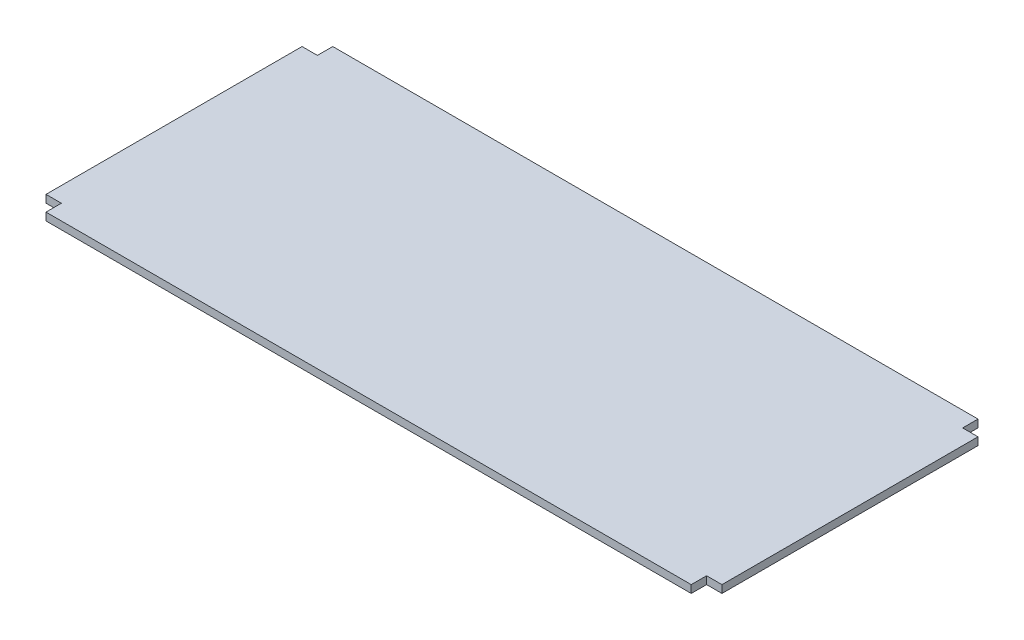
ISO-10303-21;
HEADER;
FILE_DESCRIPTION(('STEP AP214'),'2;1');
FILE_NAME('part.step','',(''),(''),'','','');
FILE_SCHEMA(('AUTOMOTIVE_DESIGN { 1 0 10303 214 1 1 1 1 }'));
ENDSEC;
DATA;
#1=APPLICATION_CONTEXT('core data for automotive mechanical design processes');
#2=APPLICATION_PROTOCOL_DEFINITION('international standard','automotive_design',2000,#1);
#3=PRODUCT_CONTEXT('',#1,'mechanical');
#4=PRODUCT('Part','Part','',(#3));
#5=PRODUCT_RELATED_PRODUCT_CATEGORY('part','',(#4));
#6=PRODUCT_DEFINITION_FORMATION('','',#4);
#7=PRODUCT_DEFINITION_CONTEXT('part definition',#1,'design');
#8=PRODUCT_DEFINITION('design','',#6,#7);
#9=PRODUCT_DEFINITION_SHAPE('','',#8);
#10=(LENGTH_UNIT() NAMED_UNIT(*) SI_UNIT(.MILLI.,.METRE.));
#11=(NAMED_UNIT(*) PLANE_ANGLE_UNIT() SI_UNIT($,.RADIAN.));
#12=(NAMED_UNIT(*) SI_UNIT($,.STERADIAN.) SOLID_ANGLE_UNIT());
#13=UNCERTAINTY_MEASURE_WITH_UNIT(LENGTH_MEASURE(1.E-05),#10,'distance_accuracy_value','');
#14=(GEOMETRIC_REPRESENTATION_CONTEXT(3) GLOBAL_UNCERTAINTY_ASSIGNED_CONTEXT((#13)) GLOBAL_UNIT_ASSIGNED_CONTEXT((#10,
#11,#12)) REPRESENTATION_CONTEXT('',''));
#15=CARTESIAN_POINT('',(0.,0.,0.));
#16=DIRECTION('',(0.,0.,1.));
#17=DIRECTION('',(1.,0.,0.));
#18=AXIS2_PLACEMENT_3D('',#15,#16,#17);
#19=CARTESIAN_POINT('',(-800.1,19.05,355.6));
#20=DIRECTION('',(1.,0.,0.));
#21=DIRECTION('',(0.,0.,-1.));
#22=AXIS2_PLACEMENT_3D('',#19,#20,#21);
#23=PLANE('',#22);
#24=DIRECTION('',(0.,0.,1.));
#25=VECTOR('',#24,1.);
#26=CARTESIAN_POINT('',(-800.1,0.,355.6));
#27=LINE('',#26,#25);
#28=CARTESIAN_POINT('',(-800.1,0.,317.5));
#29=VERTEX_POINT('',#28);
#30=CARTESIAN_POINT('',(-800.1,0.,355.6));
#31=VERTEX_POINT('',#30);
#32=EDGE_CURVE('E152',#29,#31,#27,.T.);
#33=ORIENTED_EDGE('',*,*,#32,.T.);
#34=DIRECTION('',(0.,-1.,0.));
#35=VECTOR('',#34,1.);
#36=CARTESIAN_POINT('',(-800.1,19.05,355.6));
#37=LINE('',#36,#35);
#38=CARTESIAN_POINT('',(-800.1,19.05,355.6));
#39=VERTEX_POINT('',#38);
#40=EDGE_CURVE('E11',#39,#31,#37,.T.);
#41=ORIENTED_EDGE('',*,*,#40,.F.);
#42=DIRECTION('',(0.,0.,1.));
#43=VECTOR('',#42,1.);
#44=CARTESIAN_POINT('',(-800.1,19.05,355.6));
#45=LINE('',#44,#43);
#46=CARTESIAN_POINT('',(-800.1,19.05,317.5));
#47=VERTEX_POINT('',#46);
#48=EDGE_CURVE('E174',#47,#39,#45,.T.);
#49=ORIENTED_EDGE('',*,*,#48,.F.);
#50=DIRECTION('',(0.,-1.,0.));
#51=VECTOR('',#50,1.);
#52=CARTESIAN_POINT('',(-800.1,19.05,317.5));
#53=LINE('',#52,#51);
#54=EDGE_CURVE('E148',#47,#29,#53,.T.);
#55=ORIENTED_EDGE('',*,*,#54,.T.);
#56=EDGE_LOOP('',(#33,#41,#49,#55));
#57=FACE_BOUND('',#56,.T.);
#58=ADVANCED_FACE('F32',(#57),#23,.F.);
#59=CARTESIAN_POINT('',(800.1,19.05,355.6));
#60=DIRECTION('',(0.,0.,-1.));
#61=DIRECTION('',(-1.,0.,0.));
#62=AXIS2_PLACEMENT_3D('',#59,#60,#61);
#63=PLANE('',#62);
#64=DIRECTION('',(1.,0.,0.));
#65=VECTOR('',#64,1.);
#66=CARTESIAN_POINT('',(800.1,0.,355.6));
#67=LINE('',#66,#65);
#68=CARTESIAN_POINT('',(800.1,0.,355.6));
#69=VERTEX_POINT('',#68);
#70=EDGE_CURVE('E155',#31,#69,#67,.T.);
#71=ORIENTED_EDGE('',*,*,#70,.T.);
#72=DIRECTION('',(0.,-1.,0.));
#73=VECTOR('',#72,1.);
#74=CARTESIAN_POINT('',(800.1,19.05,355.6));
#75=LINE('',#74,#73);
#76=CARTESIAN_POINT('',(800.1,19.05,355.6));
#77=VERTEX_POINT('',#76);
#78=EDGE_CURVE('E40',#77,#69,#75,.T.);
#79=ORIENTED_EDGE('',*,*,#78,.F.);
#80=DIRECTION('',(1.,0.,0.));
#81=VECTOR('',#80,1.);
#82=CARTESIAN_POINT('',(800.1,19.05,355.6));
#83=LINE('',#82,#81);
#84=EDGE_CURVE('E103',#39,#77,#83,.T.);
#85=ORIENTED_EDGE('',*,*,#84,.F.);
#86=ORIENTED_EDGE('',*,*,#40,.T.);
#87=EDGE_LOOP('',(#71,#79,#85,#86));
#88=FACE_BOUND('',#87,.T.);
#89=ADVANCED_FACE('F252',(#88),#63,.F.);
#90=CARTESIAN_POINT('',(800.1,19.05,355.6));
#91=DIRECTION('',(-1.,0.,0.));
#92=DIRECTION('',(0.,0.,1.));
#93=AXIS2_PLACEMENT_3D('',#90,#91,#92);
#94=PLANE('',#93);
#95=DIRECTION('',(0.,0.,-1.));
#96=VECTOR('',#95,1.);
#97=CARTESIAN_POINT('',(800.1,0.,355.6));
#98=LINE('',#97,#96);
#99=CARTESIAN_POINT('',(800.1,0.,317.5));
#100=VERTEX_POINT('',#99);
#101=EDGE_CURVE('E157',#69,#100,#98,.T.);
#102=ORIENTED_EDGE('',*,*,#101,.T.);
#103=DIRECTION('',(0.,-1.,0.));
#104=VECTOR('',#103,1.);
#105=CARTESIAN_POINT('',(800.1,19.05,317.5));
#106=LINE('',#105,#104);
#107=CARTESIAN_POINT('',(800.1,19.05,317.5));
#108=VERTEX_POINT('',#107);
#109=EDGE_CURVE('E193',#108,#100,#106,.T.);
#110=ORIENTED_EDGE('',*,*,#109,.F.);
#111=DIRECTION('',(0.,0.,-1.));
#112=VECTOR('',#111,1.);
#113=CARTESIAN_POINT('',(800.1,19.05,355.6));
#114=LINE('',#113,#112);
#115=EDGE_CURVE('E201',#77,#108,#114,.T.);
#116=ORIENTED_EDGE('',*,*,#115,.F.);
#117=ORIENTED_EDGE('',*,*,#78,.T.);
#118=EDGE_LOOP('',(#102,#110,#116,#117));
#119=FACE_BOUND('',#118,.T.);
#120=ADVANCED_FACE('F199',(#119),#94,.F.);
#121=CARTESIAN_POINT('',(838.2,19.05,317.5));
#122=DIRECTION('',(0.,0.,-1.));
#123=DIRECTION('',(-1.,0.,0.));
#124=AXIS2_PLACEMENT_3D('',#121,#122,#123);
#125=PLANE('',#124);
#126=DIRECTION('',(1.,0.,0.));
#127=VECTOR('',#126,1.);
#128=CARTESIAN_POINT('',(838.2,0.,317.5));
#129=LINE('',#128,#127);
#130=CARTESIAN_POINT('',(838.2,0.,317.5));
#131=VERTEX_POINT('',#130);
#132=EDGE_CURVE('E159',#100,#131,#129,.T.);
#133=ORIENTED_EDGE('',*,*,#132,.T.);
#134=DIRECTION('',(0.,-1.,0.));
#135=VECTOR('',#134,1.);
#136=CARTESIAN_POINT('',(838.2,19.05,317.5));
#137=LINE('',#136,#135);
#138=CARTESIAN_POINT('',(838.2,19.05,317.5));
#139=VERTEX_POINT('',#138);
#140=EDGE_CURVE('E190',#139,#131,#137,.T.);
#141=ORIENTED_EDGE('',*,*,#140,.F.);
#142=DIRECTION('',(1.,0.,0.));
#143=VECTOR('',#142,1.);
#144=CARTESIAN_POINT('',(838.2,19.05,317.5));
#145=LINE('',#144,#143);
#146=EDGE_CURVE('E219',#108,#139,#145,.T.);
#147=ORIENTED_EDGE('',*,*,#146,.F.);
#148=ORIENTED_EDGE('',*,*,#109,.T.);
#149=EDGE_LOOP('',(#133,#141,#147,#148));
#150=FACE_BOUND('',#149,.T.);
#151=ADVANCED_FACE('F210',(#150),#125,.F.);
#152=CARTESIAN_POINT('',(838.2,19.05,317.5));
#153=DIRECTION('',(-1.,0.,0.));
#154=DIRECTION('',(0.,0.,1.));
#155=AXIS2_PLACEMENT_3D('',#152,#153,#154);
#156=PLANE('',#155);
#157=DIRECTION('',(0.,0.,-1.));
#158=VECTOR('',#157,1.);
#159=CARTESIAN_POINT('',(838.2,0.,317.5));
#160=LINE('',#159,#158);
#161=CARTESIAN_POINT('',(838.2,0.,-317.5));
#162=VERTEX_POINT('',#161);
#163=EDGE_CURVE('E161',#131,#162,#160,.T.);
#164=ORIENTED_EDGE('',*,*,#163,.T.);
#165=DIRECTION('',(0.,-1.,0.));
#166=VECTOR('',#165,1.);
#167=CARTESIAN_POINT('',(838.2,19.05,-317.5));
#168=LINE('',#167,#166);
#169=CARTESIAN_POINT('',(838.2,19.05,-317.5));
#170=VERTEX_POINT('',#169);
#171=EDGE_CURVE('E187',#170,#162,#168,.T.);
#172=ORIENTED_EDGE('',*,*,#171,.F.);
#173=DIRECTION('',(0.,0.,-1.));
#174=VECTOR('',#173,1.);
#175=CARTESIAN_POINT('',(838.2,19.05,317.5));
#176=LINE('',#175,#174);
#177=EDGE_CURVE('E216',#139,#170,#176,.T.);
#178=ORIENTED_EDGE('',*,*,#177,.F.);
#179=ORIENTED_EDGE('',*,*,#140,.T.);
#180=EDGE_LOOP('',(#164,#172,#178,#179));
#181=FACE_BOUND('',#180,.T.);
#182=ADVANCED_FACE('F214',(#181),#156,.F.);
#183=CARTESIAN_POINT('',(838.2,19.05,-317.5));
#184=DIRECTION('',(0.,0.,1.));
#185=DIRECTION('',(1.,0.,0.));
#186=AXIS2_PLACEMENT_3D('',#183,#184,#185);
#187=PLANE('',#186);
#188=DIRECTION('',(-1.,0.,0.));
#189=VECTOR('',#188,1.);
#190=CARTESIAN_POINT('',(838.2,0.,-317.5));
#191=LINE('',#190,#189);
#192=CARTESIAN_POINT('',(800.1,0.,-317.5));
#193=VERTEX_POINT('',#192);
#194=EDGE_CURVE('E163',#162,#193,#191,.T.);
#195=ORIENTED_EDGE('',*,*,#194,.T.);
#196=DIRECTION('',(0.,-1.,0.));
#197=VECTOR('',#196,1.);
#198=CARTESIAN_POINT('',(800.1,19.05,-317.5));
#199=LINE('',#198,#197);
#200=CARTESIAN_POINT('',(800.1,19.05,-317.5));
#201=VERTEX_POINT('',#200);
#202=EDGE_CURVE('E184',#201,#193,#199,.T.);
#203=ORIENTED_EDGE('',*,*,#202,.F.);
#204=DIRECTION('',(-1.,0.,0.));
#205=VECTOR('',#204,1.);
#206=CARTESIAN_POINT('',(838.2,19.05,-317.5));
#207=LINE('',#206,#205);
#208=EDGE_CURVE('E218',#170,#201,#207,.T.);
#209=ORIENTED_EDGE('',*,*,#208,.F.);
#210=ORIENTED_EDGE('',*,*,#171,.T.);
#211=EDGE_LOOP('',(#195,#203,#209,#210));
#212=FACE_BOUND('',#211,.T.);
#213=ADVANCED_FACE('F265',(#212),#187,.F.);
#214=CARTESIAN_POINT('',(800.1,19.05,-355.6));
#215=DIRECTION('',(-1.,0.,0.));
#216=DIRECTION('',(0.,0.,1.));
#217=AXIS2_PLACEMENT_3D('',#214,#215,#216);
#218=PLANE('',#217);
#219=DIRECTION('',(0.,0.,-1.));
#220=VECTOR('',#219,1.);
#221=CARTESIAN_POINT('',(800.1,0.,-355.6));
#222=LINE('',#221,#220);
#223=CARTESIAN_POINT('',(800.1,0.,-355.6));
#224=VERTEX_POINT('',#223);
#225=EDGE_CURVE('E165',#193,#224,#222,.T.);
#226=ORIENTED_EDGE('',*,*,#225,.T.);
#227=DIRECTION('',(0.,-1.,0.));
#228=VECTOR('',#227,1.);
#229=CARTESIAN_POINT('',(800.1,19.05,-355.6));
#230=LINE('',#229,#228);
#231=CARTESIAN_POINT('',(800.1,19.05,-355.6));
#232=VERTEX_POINT('',#231);
#233=EDGE_CURVE('E181',#232,#224,#230,.T.);
#234=ORIENTED_EDGE('',*,*,#233,.F.);
#235=DIRECTION('',(0.,0.,-1.));
#236=VECTOR('',#235,1.);
#237=CARTESIAN_POINT('',(800.1,19.05,-355.6));
#238=LINE('',#237,#236);
#239=EDGE_CURVE('E221',#201,#232,#238,.T.);
#240=ORIENTED_EDGE('',*,*,#239,.F.);
#241=ORIENTED_EDGE('',*,*,#202,.T.);
#242=EDGE_LOOP('',(#226,#234,#240,#241));
#243=FACE_BOUND('',#242,.T.);
#244=ADVANCED_FACE('F268',(#243),#218,.F.);
#245=CARTESIAN_POINT('',(800.1,19.05,-355.6));
#246=DIRECTION('',(0.,0.,1.));
#247=DIRECTION('',(1.,0.,0.));
#248=AXIS2_PLACEMENT_3D('',#245,#246,#247);
#249=PLANE('',#248);
#250=DIRECTION('',(-1.,0.,0.));
#251=VECTOR('',#250,1.);
#252=CARTESIAN_POINT('',(800.1,0.,-355.6));
#253=LINE('',#252,#251);
#254=CARTESIAN_POINT('',(-800.1,0.,-355.6));
#255=VERTEX_POINT('',#254);
#256=EDGE_CURVE('E167',#224,#255,#253,.T.);
#257=ORIENTED_EDGE('',*,*,#256,.T.);
#258=DIRECTION('',(0.,-1.,0.));
#259=VECTOR('',#258,1.);
#260=CARTESIAN_POINT('',(-800.1,19.05,-355.6));
#261=LINE('',#260,#259);
#262=CARTESIAN_POINT('',(-800.1,19.05,-355.6));
#263=VERTEX_POINT('',#262);
#264=EDGE_CURVE('E178',#263,#255,#261,.T.);
#265=ORIENTED_EDGE('',*,*,#264,.F.);
#266=DIRECTION('',(-1.,0.,0.));
#267=VECTOR('',#266,1.);
#268=CARTESIAN_POINT('',(800.1,19.05,-355.6));
#269=LINE('',#268,#267);
#270=EDGE_CURVE('E227',#232,#263,#269,.T.);
#271=ORIENTED_EDGE('',*,*,#270,.F.);
#272=ORIENTED_EDGE('',*,*,#233,.T.);
#273=EDGE_LOOP('',(#257,#265,#271,#272));
#274=FACE_BOUND('',#273,.T.);
#275=ADVANCED_FACE('F233',(#274),#249,.F.);
#276=CARTESIAN_POINT('',(-800.1,19.05,-355.6));
#277=DIRECTION('',(1.,0.,0.));
#278=DIRECTION('',(0.,0.,-1.));
#279=AXIS2_PLACEMENT_3D('',#276,#277,#278);
#280=PLANE('',#279);
#281=DIRECTION('',(0.,0.,1.));
#282=VECTOR('',#281,1.);
#283=CARTESIAN_POINT('',(-800.1,0.,-355.6));
#284=LINE('',#283,#282);
#285=CARTESIAN_POINT('',(-800.1,0.,-317.5));
#286=VERTEX_POINT('',#285);
#287=EDGE_CURVE('E169',#255,#286,#284,.T.);
#288=ORIENTED_EDGE('',*,*,#287,.T.);
#289=DIRECTION('',(0.,-1.,0.));
#290=VECTOR('',#289,1.);
#291=CARTESIAN_POINT('',(-800.1,19.05,-317.5));
#292=LINE('',#291,#290);
#293=CARTESIAN_POINT('',(-800.1,19.05,-317.5));
#294=VERTEX_POINT('',#293);
#295=EDGE_CURVE('E143',#294,#286,#292,.T.);
#296=ORIENTED_EDGE('',*,*,#295,.F.);
#297=DIRECTION('',(0.,0.,1.));
#298=VECTOR('',#297,1.);
#299=CARTESIAN_POINT('',(-800.1,19.05,-355.6));
#300=LINE('',#299,#298);
#301=EDGE_CURVE('E134',#263,#294,#300,.T.);
#302=ORIENTED_EDGE('',*,*,#301,.F.);
#303=ORIENTED_EDGE('',*,*,#264,.T.);
#304=EDGE_LOOP('',(#288,#296,#302,#303));
#305=FACE_BOUND('',#304,.T.);
#306=ADVANCED_FACE('F237',(#305),#280,.F.);
#307=CARTESIAN_POINT('',(-838.2,19.05,-317.5));
#308=DIRECTION('',(0.,0.,1.));
#309=DIRECTION('',(1.,0.,0.));
#310=AXIS2_PLACEMENT_3D('',#307,#308,#309);
#311=PLANE('',#310);
#312=DIRECTION('',(-1.,0.,0.));
#313=VECTOR('',#312,1.);
#314=CARTESIAN_POINT('',(-838.2,0.,-317.5));
#315=LINE('',#314,#313);
#316=CARTESIAN_POINT('',(-838.2,0.,-317.5));
#317=VERTEX_POINT('',#316);
#318=EDGE_CURVE('E142',#286,#317,#315,.T.);
#319=ORIENTED_EDGE('',*,*,#318,.T.);
#320=DIRECTION('',(0.,-1.,0.));
#321=VECTOR('',#320,1.);
#322=CARTESIAN_POINT('',(-838.2,19.05,-317.5));
#323=LINE('',#322,#321);
#324=CARTESIAN_POINT('',(-838.2,19.05,-317.5));
#325=VERTEX_POINT('',#324);
#326=EDGE_CURVE('E139',#325,#317,#323,.T.);
#327=ORIENTED_EDGE('',*,*,#326,.F.);
#328=DIRECTION('',(-1.,0.,0.));
#329=VECTOR('',#328,1.);
#330=CARTESIAN_POINT('',(-838.2,19.05,-317.5));
#331=LINE('',#330,#329);
#332=EDGE_CURVE('E128',#294,#325,#331,.T.);
#333=ORIENTED_EDGE('',*,*,#332,.F.);
#334=ORIENTED_EDGE('',*,*,#295,.T.);
#335=EDGE_LOOP('',(#319,#327,#333,#334));
#336=FACE_BOUND('',#335,.T.);
#337=ADVANCED_FACE('F140',(#336),#311,.F.);
#338=CARTESIAN_POINT('',(-838.2,19.05,317.5));
#339=DIRECTION('',(1.,0.,0.));
#340=DIRECTION('',(0.,0.,-1.));
#341=AXIS2_PLACEMENT_3D('',#338,#339,#340);
#342=PLANE('',#341);
#343=DIRECTION('',(0.,0.,1.));
#344=VECTOR('',#343,1.);
#345=CARTESIAN_POINT('',(-838.2,0.,317.5));
#346=LINE('',#345,#344);
#347=CARTESIAN_POINT('',(-838.2,0.,317.5));
#348=VERTEX_POINT('',#347);
#349=EDGE_CURVE('E89',#317,#348,#346,.T.);
#350=ORIENTED_EDGE('',*,*,#349,.T.);
#351=DIRECTION('',(0.,-1.,0.));
#352=VECTOR('',#351,1.);
#353=CARTESIAN_POINT('',(-838.2,19.05,317.5));
#354=LINE('',#353,#352);
#355=CARTESIAN_POINT('',(-838.2,19.05,317.5));
#356=VERTEX_POINT('',#355);
#357=EDGE_CURVE('E144',#356,#348,#354,.T.);
#358=ORIENTED_EDGE('',*,*,#357,.F.);
#359=DIRECTION('',(0.,0.,1.));
#360=VECTOR('',#359,1.);
#361=CARTESIAN_POINT('',(-838.2,19.05,317.5));
#362=LINE('',#361,#360);
#363=EDGE_CURVE('E132',#325,#356,#362,.T.);
#364=ORIENTED_EDGE('',*,*,#363,.F.);
#365=ORIENTED_EDGE('',*,*,#326,.T.);
#366=EDGE_LOOP('',(#350,#358,#364,#365));
#367=FACE_BOUND('',#366,.T.);
#368=ADVANCED_FACE('F146',(#367),#342,.F.);
#369=CARTESIAN_POINT('',(-838.2,19.05,317.5));
#370=DIRECTION('',(0.,0.,-1.));
#371=DIRECTION('',(-1.,0.,0.));
#372=AXIS2_PLACEMENT_3D('',#369,#370,#371);
#373=PLANE('',#372);
#374=DIRECTION('',(1.,0.,0.));
#375=VECTOR('',#374,1.);
#376=CARTESIAN_POINT('',(-838.2,0.,317.5));
#377=LINE('',#376,#375);
#378=EDGE_CURVE('E95',#348,#29,#377,.T.);
#379=ORIENTED_EDGE('',*,*,#378,.T.);
#380=ORIENTED_EDGE('',*,*,#54,.F.);
#381=DIRECTION('',(1.,0.,0.));
#382=VECTOR('',#381,1.);
#383=CARTESIAN_POINT('',(-838.2,19.05,317.5));
#384=LINE('',#383,#382);
#385=EDGE_CURVE('E48',#356,#47,#384,.T.);
#386=ORIENTED_EDGE('',*,*,#385,.F.);
#387=ORIENTED_EDGE('',*,*,#357,.T.);
#388=EDGE_LOOP('',(#379,#380,#386,#387));
#389=FACE_BOUND('',#388,.T.);
#390=ADVANCED_FACE('F241',(#389),#373,.F.);
#391=CARTESIAN_POINT('',(0.,19.05,0.));
#392=DIRECTION('',(0.,-1.,0.));
#393=DIRECTION('',(0.,0.,-1.));
#394=AXIS2_PLACEMENT_3D('',#391,#392,#393);
#395=PLANE('',#394);
#396=ORIENTED_EDGE('',*,*,#48,.T.);
#397=ORIENTED_EDGE('',*,*,#84,.T.);
#398=ORIENTED_EDGE('',*,*,#115,.T.);
#399=ORIENTED_EDGE('',*,*,#146,.T.);
#400=ORIENTED_EDGE('',*,*,#177,.T.);
#401=ORIENTED_EDGE('',*,*,#208,.T.);
#402=ORIENTED_EDGE('',*,*,#239,.T.);
#403=ORIENTED_EDGE('',*,*,#270,.T.);
#404=ORIENTED_EDGE('',*,*,#301,.T.);
#405=ORIENTED_EDGE('',*,*,#332,.T.);
#406=ORIENTED_EDGE('',*,*,#363,.T.);
#407=ORIENTED_EDGE('',*,*,#385,.T.);
#408=EDGE_LOOP('',(#396,#397,#398,#399,#400,#401,#402,#403,#404,#405,#406,#407));
#409=FACE_BOUND('',#408,.T.);
#410=ADVANCED_FACE('F130',(#409),#395,.F.);
#411=CARTESIAN_POINT('',(0.,0.,0.));
#412=DIRECTION('',(0.,-1.,0.));
#413=DIRECTION('',(0.,0.,-1.));
#414=AXIS2_PLACEMENT_3D('',#411,#412,#413);
#415=PLANE('',#414);
#416=ORIENTED_EDGE('',*,*,#32,.F.);
#417=ORIENTED_EDGE('',*,*,#378,.F.);
#418=ORIENTED_EDGE('',*,*,#349,.F.);
#419=ORIENTED_EDGE('',*,*,#318,.F.);
#420=ORIENTED_EDGE('',*,*,#287,.F.);
#421=ORIENTED_EDGE('',*,*,#256,.F.);
#422=ORIENTED_EDGE('',*,*,#225,.F.);
#423=ORIENTED_EDGE('',*,*,#194,.F.);
#424=ORIENTED_EDGE('',*,*,#163,.F.);
#425=ORIENTED_EDGE('',*,*,#132,.F.);
#426=ORIENTED_EDGE('',*,*,#101,.F.);
#427=ORIENTED_EDGE('',*,*,#70,.F.);
#428=EDGE_LOOP('',(#416,#417,#418,#419,#420,#421,#422,#423,#424,#425,#426,#427));
#429=FACE_BOUND('',#428,.T.);
#430=ADVANCED_FACE('F205',(#429),#415,.T.);
#431=CLOSED_SHELL('',(#58,#89,#120,#151,#182,#213,#244,#275,#306,#337,#368,#390,#410,#430));
#432=MANIFOLD_SOLID_BREP('B2',#431);
#433=ADVANCED_BREP_SHAPE_REPRESENTATION('',(#18,#432),#14);
#434=SHAPE_DEFINITION_REPRESENTATION(#9,#433);
ENDSEC;
END-ISO-10303-21;
